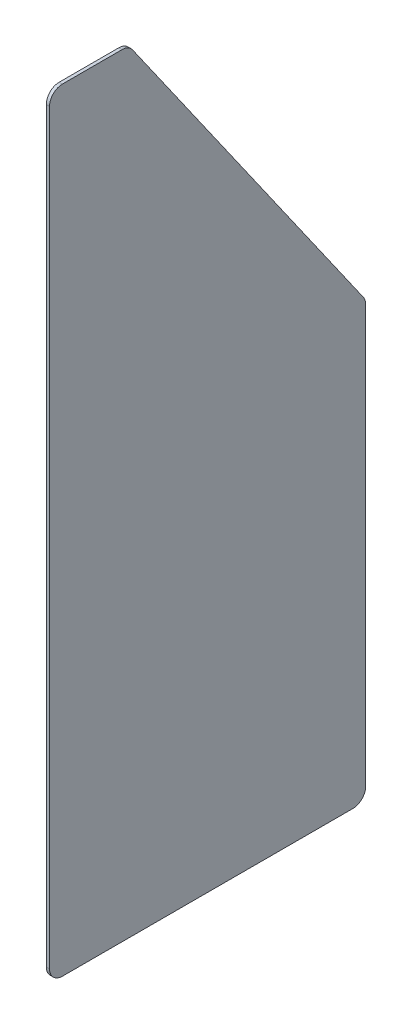
ISO-10303-21;
HEADER;
FILE_DESCRIPTION(('STEP AP214'),'2;1');
FILE_NAME('part.step','',(''),(''),'','','');
FILE_SCHEMA(('AUTOMOTIVE_DESIGN { 1 0 10303 214 1 1 1 1 }'));
ENDSEC;
DATA;
#1=APPLICATION_CONTEXT('core data for automotive mechanical design processes');
#2=APPLICATION_PROTOCOL_DEFINITION('international standard','automotive_design',2000,#1);
#3=PRODUCT_CONTEXT('',#1,'mechanical');
#4=PRODUCT('Part','Part','',(#3));
#5=PRODUCT_RELATED_PRODUCT_CATEGORY('part','',(#4));
#6=PRODUCT_DEFINITION_FORMATION('','',#4);
#7=PRODUCT_DEFINITION_CONTEXT('part definition',#1,'design');
#8=PRODUCT_DEFINITION('design','',#6,#7);
#9=PRODUCT_DEFINITION_SHAPE('','',#8);
#10=(LENGTH_UNIT() NAMED_UNIT(*) SI_UNIT(.MILLI.,.METRE.));
#11=(NAMED_UNIT(*) PLANE_ANGLE_UNIT() SI_UNIT($,.RADIAN.));
#12=(NAMED_UNIT(*) SI_UNIT($,.STERADIAN.) SOLID_ANGLE_UNIT());
#13=UNCERTAINTY_MEASURE_WITH_UNIT(LENGTH_MEASURE(1.E-05),#10,'distance_accuracy_value','');
#14=(GEOMETRIC_REPRESENTATION_CONTEXT(3) GLOBAL_UNCERTAINTY_ASSIGNED_CONTEXT((#13)) GLOBAL_UNIT_ASSIGNED_CONTEXT((#10,
#11,#12)) REPRESENTATION_CONTEXT('',''));
#15=CARTESIAN_POINT('',(0.,0.,0.));
#16=DIRECTION('',(0.,0.,1.));
#17=DIRECTION('',(1.,0.,0.));
#18=AXIS2_PLACEMENT_3D('',#15,#16,#17);
#19=CARTESIAN_POINT('',(1.58750000000002,381.,0.));
#20=DIRECTION('',(0.,0.,-1.));
#21=DIRECTION('',(-1.,0.,0.));
#22=AXIS2_PLACEMENT_3D('',#19,#20,#21);
#23=PLANE('',#22);
#24=DIRECTION('',(0.,-1.,0.));
#25=VECTOR('',#24,1.);
#26=CARTESIAN_POINT('',(0.,381.,0.));
#27=LINE('',#26,#25);
#28=CARTESIAN_POINT('',(0.,374.65,0.));
#29=VERTEX_POINT('',#28);
#30=CARTESIAN_POINT('',(0.,6.35000000000002,0.));
#31=VERTEX_POINT('',#30);
#32=EDGE_CURVE('E133',#29,#31,#27,.T.);
#33=ORIENTED_EDGE('',*,*,#32,.T.);
#34=DIRECTION('',(1.,0.,0.));
#35=VECTOR('',#34,1.);
#36=CARTESIAN_POINT('',(1.58750000000002,6.35000000000002,0.));
#37=LINE('',#36,#35);
#38=CARTESIAN_POINT('',(1.58750000000002,6.35000000000002,0.));
#39=VERTEX_POINT('',#38);
#40=EDGE_CURVE('E163',#31,#39,#37,.T.);
#41=ORIENTED_EDGE('',*,*,#40,.T.);
#42=DIRECTION('',(0.,-1.,0.));
#43=VECTOR('',#42,1.);
#44=CARTESIAN_POINT('',(1.58750000000002,381.,0.));
#45=LINE('',#44,#43);
#46=CARTESIAN_POINT('',(1.58750000000002,374.65,0.));
#47=VERTEX_POINT('',#46);
#48=EDGE_CURVE('E137',#47,#39,#45,.T.);
#49=ORIENTED_EDGE('',*,*,#48,.F.);
#50=DIRECTION('',(1.,0.,0.));
#51=VECTOR('',#50,1.);
#52=CARTESIAN_POINT('',(0.,374.65,0.));
#53=LINE('',#52,#51);
#54=EDGE_CURVE('E161',#47,#29,#53,.F.);
#55=ORIENTED_EDGE('',*,*,#54,.T.);
#56=EDGE_LOOP('',(#33,#41,#49,#55));
#57=FACE_BOUND('',#56,.T.);
#58=ADVANCED_FACE('F34',(#57),#23,.F.);
#59=CARTESIAN_POINT('',(1.5875,381.,-155.8925));
#60=DIRECTION('',(-1.,0.,0.));
#61=DIRECTION('',(0.,0.,1.));
#62=AXIS2_PLACEMENT_3D('',#59,#60,#61);
#63=PLANE('',#62);
#64=DIRECTION('',(0.,0.,-1.));
#65=VECTOR('',#64,1.);
#66=CARTESIAN_POINT('',(1.5875,0.,-155.8925));
#67=LINE('',#66,#65);
#68=CARTESIAN_POINT('',(1.58750000000002,0.,-6.35000000000005));
#69=VERTEX_POINT('',#68);
#70=CARTESIAN_POINT('',(1.5875,0.,-149.5425));
#71=VERTEX_POINT('',#70);
#72=EDGE_CURVE('E177',#69,#71,#67,.T.);
#73=ORIENTED_EDGE('',*,*,#72,.T.);
#74=CARTESIAN_POINT('',(1.5875,6.35000000000002,-149.5425));
#75=DIRECTION('',(-1.,0.,0.));
#76=DIRECTION('',(0.,0.,1.));
#77=AXIS2_PLACEMENT_3D('',#74,#75,#76);
#78=CIRCLE('',#77,6.35);
#79=CARTESIAN_POINT('',(1.5875,6.35000000000002,-155.8925));
#80=VERTEX_POINT('',#79);
#81=EDGE_CURVE('E159',#71,#80,#78,.F.);
#82=ORIENTED_EDGE('',*,*,#81,.T.);
#83=DIRECTION('',(0.,-1.,0.));
#84=VECTOR('',#83,1.);
#85=CARTESIAN_POINT('',(1.5875,381.,-155.8925));
#86=LINE('',#85,#84);
#87=CARTESIAN_POINT('',(1.5875,212.119982292906,-155.8925));
#88=VERTEX_POINT('',#87);
#89=EDGE_CURVE('E132',#88,#80,#86,.T.);
#90=ORIENTED_EDGE('',*,*,#89,.F.);
#91=CARTESIAN_POINT('',(1.58749999999999,212.119982292906,-149.5425));
#92=DIRECTION('',(-1.,0.,0.));
#93=DIRECTION('',(0.,0.,1.));
#94=AXIS2_PLACEMENT_3D('',#91,#92,#93);
#95=CIRCLE('',#94,6.35);
#96=CARTESIAN_POINT('',(1.58749999999998,215.761999531675,-154.744250708416));
#97=VERTEX_POINT('',#96);
#98=EDGE_CURVE('E136',#88,#97,#95,.F.);
#99=ORIENTED_EDGE('',*,*,#98,.T.);
#100=DIRECTION('',(0.,-0.819173339908049,-0.573546021853428));
#101=VECTOR('',#100,1.);
#102=CARTESIAN_POINT('',(1.58749999999999,381.,-39.0525));
#103=LINE('',#102,#101);
#104=CARTESIAN_POINT('',(1.58749999999999,378.292017238769,-40.9485001067978));
#105=VERTEX_POINT('',#104);
#106=EDGE_CURVE('E175',#105,#97,#103,.T.);
#107=ORIENTED_EDGE('',*,*,#106,.F.);
#108=CARTESIAN_POINT('',(1.58750000000001,374.65,-35.7467493983817));
#109=DIRECTION('',(-1.,0.,0.));
#110=DIRECTION('',(0.,0.,1.));
#111=AXIS2_PLACEMENT_3D('',#108,#109,#110);
#112=CIRCLE('',#111,6.35);
#113=CARTESIAN_POINT('',(1.58750000000001,381.,-35.7467493983817));
#114=VERTEX_POINT('',#113);
#115=EDGE_CURVE('E155',#105,#114,#112,.F.);
#116=ORIENTED_EDGE('',*,*,#115,.T.);
#117=DIRECTION('',(0.,0.,-1.));
#118=VECTOR('',#117,1.);
#119=CARTESIAN_POINT('',(1.5875,381.,-155.8925));
#120=LINE('',#119,#118);
#121=CARTESIAN_POINT('',(1.58750000000002,381.,-6.35000000000005));
#122=VERTEX_POINT('',#121);
#123=EDGE_CURVE('E184',#122,#114,#120,.T.);
#124=ORIENTED_EDGE('',*,*,#123,.F.);
#125=CARTESIAN_POINT('',(1.58750000000002,374.65,-6.35));
#126=DIRECTION('',(-1.,0.,0.));
#127=DIRECTION('',(0.,0.,1.));
#128=AXIS2_PLACEMENT_3D('',#125,#126,#127);
#129=CIRCLE('',#128,6.35);
#130=EDGE_CURVE('E57',#122,#47,#129,.F.);
#131=ORIENTED_EDGE('',*,*,#130,.T.);
#132=ORIENTED_EDGE('',*,*,#48,.T.);
#133=CARTESIAN_POINT('',(1.58750000000002,6.35000000000002,-6.35));
#134=DIRECTION('',(-1.,0.,0.));
#135=DIRECTION('',(0.,0.,1.));
#136=AXIS2_PLACEMENT_3D('',#133,#134,#135);
#137=CIRCLE('',#136,6.35);
#138=EDGE_CURVE('E49',#39,#69,#137,.F.);
#139=ORIENTED_EDGE('',*,*,#138,.T.);
#140=EDGE_LOOP('',(#73,#82,#90,#99,#107,#116,#124,#131,#132,#139));
#141=FACE_BOUND('',#140,.T.);
#142=ADVANCED_FACE('F216',(#141),#63,.F.);
#143=CARTESIAN_POINT('',(1.5875,381.,-155.8925));
#144=DIRECTION('',(0.,0.,1.));
#145=DIRECTION('',(1.,0.,0.));
#146=AXIS2_PLACEMENT_3D('',#143,#144,#145);
#147=PLANE('',#146);
#148=ORIENTED_EDGE('',*,*,#89,.T.);
#149=DIRECTION('',(-1.,0.,0.));
#150=VECTOR('',#149,1.);
#151=CARTESIAN_POINT('',(1.5875,6.35000000000002,-155.8925));
#152=LINE('',#151,#150);
#153=CARTESIAN_POINT('',(0.,6.35000000000002,-155.8925));
#154=VERTEX_POINT('',#153);
#155=EDGE_CURVE('E123',#80,#154,#152,.T.);
#156=ORIENTED_EDGE('',*,*,#155,.T.);
#157=DIRECTION('',(0.,-1.,0.));
#158=VECTOR('',#157,1.);
#159=CARTESIAN_POINT('',(0.,381.,-155.8925));
#160=LINE('',#159,#158);
#161=CARTESIAN_POINT('',(0.,212.119982292906,-155.8925));
#162=VERTEX_POINT('',#161);
#163=EDGE_CURVE('E115',#162,#154,#160,.T.);
#164=ORIENTED_EDGE('',*,*,#163,.F.);
#165=DIRECTION('',(-1.,0.,0.));
#166=VECTOR('',#165,1.);
#167=CARTESIAN_POINT('',(1.5875,212.119982292906,-155.8925));
#168=LINE('',#167,#166);
#169=EDGE_CURVE('E129',#162,#88,#168,.F.);
#170=ORIENTED_EDGE('',*,*,#169,.T.);
#171=EDGE_LOOP('',(#148,#156,#164,#170));
#172=FACE_BOUND('',#171,.T.);
#173=ADVANCED_FACE('F128',(#172),#147,.F.);
#174=CARTESIAN_POINT('',(0.,381.,-155.8925));
#175=DIRECTION('',(1.,0.,0.));
#176=DIRECTION('',(0.,0.,-1.));
#177=AXIS2_PLACEMENT_3D('',#174,#175,#176);
#178=PLANE('',#177);
#179=ORIENTED_EDGE('',*,*,#163,.T.);
#180=CARTESIAN_POINT('',(0.,6.35000000000002,-149.5425));
#181=DIRECTION('',(1.,0.,0.));
#182=DIRECTION('',(0.,0.,-1.));
#183=AXIS2_PLACEMENT_3D('',#180,#181,#182);
#184=CIRCLE('',#183,6.35);
#185=CARTESIAN_POINT('',(0.,0.,-149.5425));
#186=VERTEX_POINT('',#185);
#187=EDGE_CURVE('E148',#154,#186,#184,.F.);
#188=ORIENTED_EDGE('',*,*,#187,.T.);
#189=DIRECTION('',(0.,0.,1.));
#190=VECTOR('',#189,1.);
#191=CARTESIAN_POINT('',(0.,0.,-155.8925));
#192=LINE('',#191,#190);
#193=CARTESIAN_POINT('',(0.,0.,-6.35000000000005));
#194=VERTEX_POINT('',#193);
#195=EDGE_CURVE('E180',#186,#194,#192,.T.);
#196=ORIENTED_EDGE('',*,*,#195,.T.);
#197=CARTESIAN_POINT('',(0.,6.35000000000002,-6.35));
#198=DIRECTION('',(1.,0.,0.));
#199=DIRECTION('',(0.,0.,-1.));
#200=AXIS2_PLACEMENT_3D('',#197,#198,#199);
#201=CIRCLE('',#200,6.35);
#202=EDGE_CURVE('E146',#194,#31,#201,.F.);
#203=ORIENTED_EDGE('',*,*,#202,.T.);
#204=ORIENTED_EDGE('',*,*,#32,.F.);
#205=CARTESIAN_POINT('',(0.,374.65,-6.35));
#206=DIRECTION('',(1.,0.,0.));
#207=DIRECTION('',(0.,0.,-1.));
#208=AXIS2_PLACEMENT_3D('',#205,#206,#207);
#209=CIRCLE('',#208,6.35);
#210=CARTESIAN_POINT('',(0.,381.,-6.35000000000005));
#211=VERTEX_POINT('',#210);
#212=EDGE_CURVE('E144',#29,#211,#209,.F.);
#213=ORIENTED_EDGE('',*,*,#212,.T.);
#214=DIRECTION('',(0.,0.,1.));
#215=VECTOR('',#214,1.);
#216=CARTESIAN_POINT('',(0.,381.,-155.8925));
#217=LINE('',#216,#215);
#218=CARTESIAN_POINT('',(0.,381.,-35.7467493983817));
#219=VERTEX_POINT('',#218);
#220=EDGE_CURVE('E187',#219,#211,#217,.T.);
#221=ORIENTED_EDGE('',*,*,#220,.F.);
#222=CARTESIAN_POINT('',(0.,374.65,-35.7467493983817));
#223=DIRECTION('',(1.,0.,0.));
#224=DIRECTION('',(0.,0.,-1.));
#225=AXIS2_PLACEMENT_3D('',#222,#223,#224);
#226=CIRCLE('',#225,6.35);
#227=CARTESIAN_POINT('',(0.,378.292017238769,-40.9485001067978));
#228=VERTEX_POINT('',#227);
#229=EDGE_CURVE('E122',#219,#228,#226,.F.);
#230=ORIENTED_EDGE('',*,*,#229,.T.);
#231=DIRECTION('',(0.,0.819173339908049,0.573546021853428));
#232=VECTOR('',#231,1.);
#233=CARTESIAN_POINT('',(0.,381.,-39.0525));
#234=LINE('',#233,#232);
#235=CARTESIAN_POINT('',(0.,215.761999531675,-154.744250708416));
#236=VERTEX_POINT('',#235);
#237=EDGE_CURVE('E117',#236,#228,#234,.T.);
#238=ORIENTED_EDGE('',*,*,#237,.F.);
#239=CARTESIAN_POINT('',(0.,212.119982292906,-149.5425));
#240=DIRECTION('',(1.,0.,0.));
#241=DIRECTION('',(0.,0.,-1.));
#242=AXIS2_PLACEMENT_3D('',#239,#240,#241);
#243=CIRCLE('',#242,6.35);
#244=EDGE_CURVE('E112',#236,#162,#243,.F.);
#245=ORIENTED_EDGE('',*,*,#244,.T.);
#246=EDGE_LOOP('',(#179,#188,#196,#203,#204,#213,#221,#230,#238,#245));
#247=FACE_BOUND('',#246,.T.);
#248=ADVANCED_FACE('F114',(#247),#178,.F.);
#249=CARTESIAN_POINT('',(0.,381.,0.));
#250=DIRECTION('',(0.,1.,0.));
#251=DIRECTION('',(0.,0.,1.));
#252=AXIS2_PLACEMENT_3D('',#249,#250,#251);
#253=PLANE('',#252);
#254=ORIENTED_EDGE('',*,*,#220,.T.);
#255=DIRECTION('',(1.,0.,0.));
#256=VECTOR('',#255,1.);
#257=CARTESIAN_POINT('',(1.58750000000003,381.,-6.35));
#258=LINE('',#257,#256);
#259=EDGE_CURVE('E168',#211,#122,#258,.T.);
#260=ORIENTED_EDGE('',*,*,#259,.T.);
#261=ORIENTED_EDGE('',*,*,#123,.T.);
#262=DIRECTION('',(-1.,0.,0.));
#263=VECTOR('',#262,1.);
#264=CARTESIAN_POINT('',(0.,381.,-35.7467493983817));
#265=LINE('',#264,#263);
#266=EDGE_CURVE('E165',#114,#219,#265,.T.);
#267=ORIENTED_EDGE('',*,*,#266,.T.);
#268=EDGE_LOOP('',(#254,#260,#261,#267));
#269=FACE_BOUND('',#268,.T.);
#270=ADVANCED_FACE('F212',(#269),#253,.T.);
#271=CARTESIAN_POINT('',(0.,0.,0.));
#272=DIRECTION('',(0.,1.,0.));
#273=DIRECTION('',(0.,0.,1.));
#274=AXIS2_PLACEMENT_3D('',#271,#272,#273);
#275=PLANE('',#274);
#276=ORIENTED_EDGE('',*,*,#195,.F.);
#277=DIRECTION('',(-1.,0.,0.));
#278=VECTOR('',#277,1.);
#279=CARTESIAN_POINT('',(0.,0.,-149.5425));
#280=LINE('',#279,#278);
#281=EDGE_CURVE('E152',#186,#71,#280,.F.);
#282=ORIENTED_EDGE('',*,*,#281,.T.);
#283=ORIENTED_EDGE('',*,*,#72,.F.);
#284=DIRECTION('',(1.,0.,0.));
#285=VECTOR('',#284,1.);
#286=CARTESIAN_POINT('',(0.,0.,-6.35));
#287=LINE('',#286,#285);
#288=EDGE_CURVE('E150',#69,#194,#287,.F.);
#289=ORIENTED_EDGE('',*,*,#288,.T.);
#290=EDGE_LOOP('',(#276,#282,#283,#289));
#291=FACE_BOUND('',#290,.T.);
#292=ADVANCED_FACE('F200',(#291),#275,.F.);
#293=CARTESIAN_POINT('',(205.30262581053,381.,-39.0525));
#294=DIRECTION('',(0.,-0.573546021853428,0.819173339908048));
#295=DIRECTION('',(0.,-0.819173339908049,-0.573546021853428));
#296=AXIS2_PLACEMENT_3D('',#293,#294,#295);
#297=PLANE('',#296);
#298=ORIENTED_EDGE('',*,*,#237,.T.);
#299=DIRECTION('',(-1.,0.,0.));
#300=VECTOR('',#299,1.);
#301=CARTESIAN_POINT('',(1.58749999999999,378.292017238769,-40.9485001067978));
#302=LINE('',#301,#300);
#303=EDGE_CURVE('E11',#228,#105,#302,.F.);
#304=ORIENTED_EDGE('',*,*,#303,.T.);
#305=ORIENTED_EDGE('',*,*,#106,.T.);
#306=DIRECTION('',(-1.,0.,0.));
#307=VECTOR('',#306,1.);
#308=CARTESIAN_POINT('',(205.30262581053,215.761999531675,-154.744250708416));
#309=LINE('',#308,#307);
#310=EDGE_CURVE('E42',#97,#236,#309,.T.);
#311=ORIENTED_EDGE('',*,*,#310,.T.);
#312=EDGE_LOOP('',(#298,#304,#305,#311));
#313=FACE_BOUND('',#312,.T.);
#314=ADVANCED_FACE('F172',(#313),#297,.F.);
#315=CARTESIAN_POINT('',(1.5875,6.35000000000002,-149.5425));
#316=DIRECTION('',(-1.,0.,0.));
#317=DIRECTION('',(0.,0.,1.));
#318=AXIS2_PLACEMENT_3D('',#315,#316,#317);
#319=CYLINDRICAL_SURFACE('',#318,6.35);
#320=ORIENTED_EDGE('',*,*,#81,.F.);
#321=ORIENTED_EDGE('',*,*,#281,.F.);
#322=ORIENTED_EDGE('',*,*,#187,.F.);
#323=ORIENTED_EDGE('',*,*,#155,.F.);
#324=EDGE_LOOP('',(#320,#321,#322,#323));
#325=FACE_BOUND('',#324,.T.);
#326=ADVANCED_FACE('F195',(#325),#319,.T.);
#327=CARTESIAN_POINT('',(1.58750000000003,6.35000000000002,-6.35));
#328=DIRECTION('',(1.,0.,0.));
#329=DIRECTION('',(0.,0.,-1.));
#330=AXIS2_PLACEMENT_3D('',#327,#328,#329);
#331=CYLINDRICAL_SURFACE('',#330,6.35);
#332=ORIENTED_EDGE('',*,*,#202,.F.);
#333=ORIENTED_EDGE('',*,*,#288,.F.);
#334=ORIENTED_EDGE('',*,*,#138,.F.);
#335=ORIENTED_EDGE('',*,*,#40,.F.);
#336=EDGE_LOOP('',(#332,#333,#334,#335));
#337=FACE_BOUND('',#336,.T.);
#338=ADVANCED_FACE('F202',(#337),#331,.T.);
#339=CARTESIAN_POINT('',(0.,374.65,-6.35));
#340=DIRECTION('',(-1.,0.,0.));
#341=DIRECTION('',(0.,0.,1.));
#342=AXIS2_PLACEMENT_3D('',#339,#340,#341);
#343=CYLINDRICAL_SURFACE('',#342,6.35);
#344=ORIENTED_EDGE('',*,*,#212,.F.);
#345=ORIENTED_EDGE('',*,*,#54,.F.);
#346=ORIENTED_EDGE('',*,*,#130,.F.);
#347=ORIENTED_EDGE('',*,*,#259,.F.);
#348=EDGE_LOOP('',(#344,#345,#346,#347));
#349=FACE_BOUND('',#348,.T.);
#350=ADVANCED_FACE('F208',(#349),#343,.T.);
#351=CARTESIAN_POINT('',(0.,374.65,-35.7467493983817));
#352=DIRECTION('',(1.,0.,0.));
#353=DIRECTION('',(0.,0.,-1.));
#354=AXIS2_PLACEMENT_3D('',#351,#352,#353);
#355=CYLINDRICAL_SURFACE('',#354,6.35);
#356=ORIENTED_EDGE('',*,*,#115,.F.);
#357=ORIENTED_EDGE('',*,*,#303,.F.);
#358=ORIENTED_EDGE('',*,*,#229,.F.);
#359=ORIENTED_EDGE('',*,*,#266,.F.);
#360=EDGE_LOOP('',(#356,#357,#358,#359));
#361=FACE_BOUND('',#360,.T.);
#362=ADVANCED_FACE('F215',(#361),#355,.T.);
#363=CARTESIAN_POINT('',(205.30262581053,212.119982292906,-149.5425));
#364=DIRECTION('',(-1.,0.,0.));
#365=DIRECTION('',(0.,0.,1.));
#366=AXIS2_PLACEMENT_3D('',#363,#364,#365);
#367=CYLINDRICAL_SURFACE('',#366,6.35);
#368=ORIENTED_EDGE('',*,*,#98,.F.);
#369=ORIENTED_EDGE('',*,*,#169,.F.);
#370=ORIENTED_EDGE('',*,*,#244,.F.);
#371=ORIENTED_EDGE('',*,*,#310,.F.);
#372=EDGE_LOOP('',(#368,#369,#370,#371));
#373=FACE_BOUND('',#372,.T.);
#374=ADVANCED_FACE('F36',(#373),#367,.T.);
#375=CLOSED_SHELL('',(#58,#142,#173,#248,#270,#292,#314,#326,#338,#350,#362,#374));
#376=MANIFOLD_SOLID_BREP('B2',#375);
#377=ADVANCED_BREP_SHAPE_REPRESENTATION('',(#18,#376),#14);
#378=SHAPE_DEFINITION_REPRESENTATION(#9,#377);
ENDSEC;
END-ISO-10303-21;
